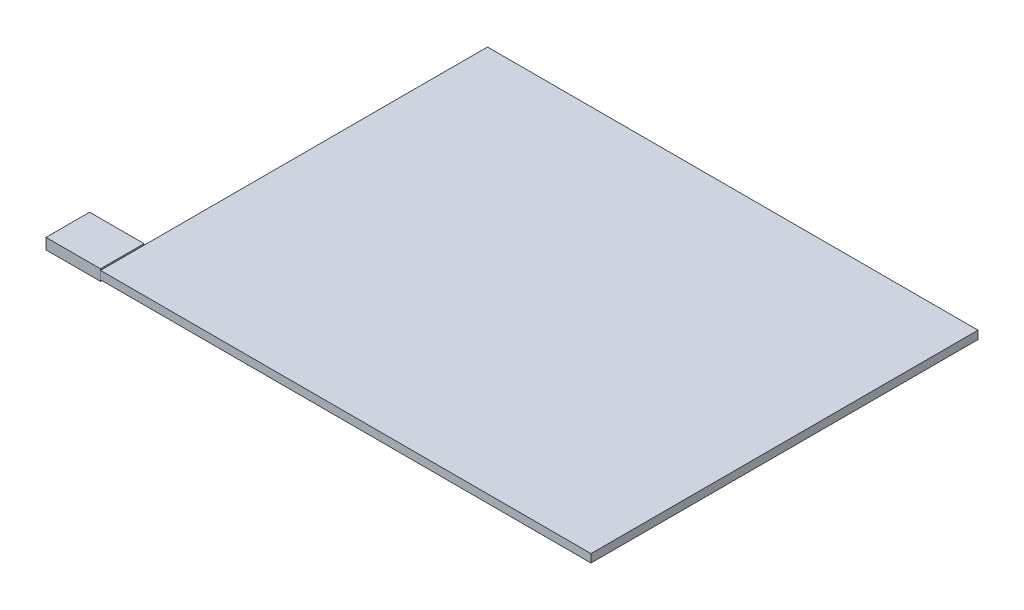
ISO-10303-21;
HEADER;
FILE_DESCRIPTION(('STEP AP214'),'2;1');
FILE_NAME('part.step','',(''),(''),'','','');
FILE_SCHEMA(('AUTOMOTIVE_DESIGN { 1 0 10303 214 1 1 1 1 }'));
ENDSEC;
DATA;
#1=APPLICATION_CONTEXT('core data for automotive mechanical design processes');
#2=APPLICATION_PROTOCOL_DEFINITION('international standard','automotive_design',2000,#1);
#3=PRODUCT_CONTEXT('',#1,'mechanical');
#4=PRODUCT('Part','Part','',(#3));
#5=PRODUCT_RELATED_PRODUCT_CATEGORY('part','',(#4));
#6=PRODUCT_DEFINITION_FORMATION('','',#4);
#7=PRODUCT_DEFINITION_CONTEXT('part definition',#1,'design');
#8=PRODUCT_DEFINITION('design','',#6,#7);
#9=PRODUCT_DEFINITION_SHAPE('','',#8);
#10=(LENGTH_UNIT() NAMED_UNIT(*) SI_UNIT(.MILLI.,.METRE.));
#11=(NAMED_UNIT(*) PLANE_ANGLE_UNIT() SI_UNIT($,.RADIAN.));
#12=(NAMED_UNIT(*) SI_UNIT($,.STERADIAN.) SOLID_ANGLE_UNIT());
#13=UNCERTAINTY_MEASURE_WITH_UNIT(LENGTH_MEASURE(1.E-05),#10,'distance_accuracy_value','');
#14=(GEOMETRIC_REPRESENTATION_CONTEXT(3) GLOBAL_UNCERTAINTY_ASSIGNED_CONTEXT((#13)) GLOBAL_UNIT_ASSIGNED_CONTEXT((#10,
#11,#12)) REPRESENTATION_CONTEXT('',''));
#15=CARTESIAN_POINT('',(0.,0.,0.));
#16=DIRECTION('',(0.,0.,1.));
#17=DIRECTION('',(1.,0.,0.));
#18=AXIS2_PLACEMENT_3D('',#15,#16,#17);
#19=CARTESIAN_POINT('',(-74.,1.,52.5));
#20=DIRECTION('',(-1.,0.,0.));
#21=DIRECTION('',(0.,0.,1.));
#22=AXIS2_PLACEMENT_3D('',#19,#20,#21);
#23=PLANE('',#22);
#24=DIRECTION('',(0.,0.,-1.));
#25=VECTOR('',#24,1.);
#26=CARTESIAN_POINT('',(-74.,-1.,52.5));
#27=LINE('',#26,#25);
#28=CARTESIAN_POINT('',(-74.,-1.,52.5));
#29=VERTEX_POINT('',#28);
#30=CARTESIAN_POINT('',(-74.,-1.,44.5));
#31=VERTEX_POINT('',#30);
#32=EDGE_CURVE('E111',#29,#31,#27,.T.);
#33=ORIENTED_EDGE('',*,*,#32,.T.);
#34=DIRECTION('',(0.,-1.,0.));
#35=VECTOR('',#34,1.);
#36=CARTESIAN_POINT('',(-74.,1.,44.5));
#37=LINE('',#36,#35);
#38=CARTESIAN_POINT('',(-74.,1.,44.5));
#39=VERTEX_POINT('',#38);
#40=EDGE_CURVE('E12',#39,#31,#37,.T.);
#41=ORIENTED_EDGE('',*,*,#40,.F.);
#42=DIRECTION('',(0.,0.,-1.));
#43=VECTOR('',#42,1.);
#44=CARTESIAN_POINT('',(-74.,1.,52.5));
#45=LINE('',#44,#43);
#46=CARTESIAN_POINT('',(-74.,1.,52.5));
#47=VERTEX_POINT('',#46);
#48=EDGE_CURVE('E99',#47,#39,#45,.T.);
#49=ORIENTED_EDGE('',*,*,#48,.F.);
#50=DIRECTION('',(0.,-1.,0.));
#51=VECTOR('',#50,1.);
#52=CARTESIAN_POINT('',(-74.,1.,52.5));
#53=LINE('',#52,#51);
#54=EDGE_CURVE('E107',#47,#29,#53,.T.);
#55=ORIENTED_EDGE('',*,*,#54,.T.);
#56=EDGE_LOOP('',(#33,#41,#49,#55));
#57=FACE_BOUND('',#56,.T.);
#58=ADVANCED_FACE('F48',(#57),#23,.F.);
#59=CARTESIAN_POINT('',(-74.,1.,44.5));
#60=DIRECTION('',(0.,0.,1.));
#61=DIRECTION('',(1.,0.,0.));
#62=AXIS2_PLACEMENT_3D('',#59,#60,#61);
#63=PLANE('',#62);
#64=DIRECTION('',(-1.,0.,0.));
#65=VECTOR('',#64,1.);
#66=CARTESIAN_POINT('',(-74.,-1.,44.5));
#67=LINE('',#66,#65);
#68=CARTESIAN_POINT('',(-84.,-1.,44.5));
#69=VERTEX_POINT('',#68);
#70=EDGE_CURVE('E103',#31,#69,#67,.T.);
#71=ORIENTED_EDGE('',*,*,#70,.T.);
#72=DIRECTION('',(0.,-1.,0.));
#73=VECTOR('',#72,1.);
#74=CARTESIAN_POINT('',(-84.,1.,44.5));
#75=LINE('',#74,#73);
#76=CARTESIAN_POINT('',(-84.,1.,44.5));
#77=VERTEX_POINT('',#76);
#78=EDGE_CURVE('E56',#77,#69,#75,.T.);
#79=ORIENTED_EDGE('',*,*,#78,.F.);
#80=DIRECTION('',(-1.,0.,0.));
#81=VECTOR('',#80,1.);
#82=CARTESIAN_POINT('',(-74.,1.,44.5));
#83=LINE('',#82,#81);
#84=EDGE_CURVE('E94',#39,#77,#83,.T.);
#85=ORIENTED_EDGE('',*,*,#84,.F.);
#86=ORIENTED_EDGE('',*,*,#40,.T.);
#87=EDGE_LOOP('',(#71,#79,#85,#86));
#88=FACE_BOUND('',#87,.T.);
#89=ADVANCED_FACE('F102',(#88),#63,.F.);
#90=CARTESIAN_POINT('',(-84.,1.,52.5));
#91=DIRECTION('',(1.,0.,0.));
#92=DIRECTION('',(0.,0.,-1.));
#93=AXIS2_PLACEMENT_3D('',#90,#91,#92);
#94=PLANE('',#93);
#95=DIRECTION('',(0.,0.,1.));
#96=VECTOR('',#95,1.);
#97=CARTESIAN_POINT('',(-84.,-1.,52.5));
#98=LINE('',#97,#96);
#99=CARTESIAN_POINT('',(-84.,-1.,52.5));
#100=VERTEX_POINT('',#99);
#101=EDGE_CURVE('E81',#69,#100,#98,.T.);
#102=ORIENTED_EDGE('',*,*,#101,.T.);
#103=DIRECTION('',(0.,-1.,0.));
#104=VECTOR('',#103,1.);
#105=CARTESIAN_POINT('',(-84.,1.,52.5));
#106=LINE('',#105,#104);
#107=CARTESIAN_POINT('',(-84.,1.,52.5));
#108=VERTEX_POINT('',#107);
#109=EDGE_CURVE('E104',#108,#100,#106,.T.);
#110=ORIENTED_EDGE('',*,*,#109,.F.);
#111=DIRECTION('',(0.,0.,1.));
#112=VECTOR('',#111,1.);
#113=CARTESIAN_POINT('',(-84.,1.,52.5));
#114=LINE('',#113,#112);
#115=EDGE_CURVE('E97',#77,#108,#114,.T.);
#116=ORIENTED_EDGE('',*,*,#115,.F.);
#117=ORIENTED_EDGE('',*,*,#78,.T.);
#118=EDGE_LOOP('',(#102,#110,#116,#117));
#119=FACE_BOUND('',#118,.T.);
#120=ADVANCED_FACE('F105',(#119),#94,.F.);
#121=CARTESIAN_POINT('',(-74.,1.,52.5));
#122=DIRECTION('',(0.,0.,-1.));
#123=DIRECTION('',(-1.,0.,0.));
#124=AXIS2_PLACEMENT_3D('',#121,#122,#123);
#125=PLANE('',#124);
#126=DIRECTION('',(1.,0.,0.));
#127=VECTOR('',#126,1.);
#128=CARTESIAN_POINT('',(-74.,-1.,52.5));
#129=LINE('',#128,#127);
#130=EDGE_CURVE('E87',#100,#29,#129,.T.);
#131=ORIENTED_EDGE('',*,*,#130,.T.);
#132=ORIENTED_EDGE('',*,*,#54,.F.);
#133=DIRECTION('',(1.,0.,0.));
#134=VECTOR('',#133,1.);
#135=CARTESIAN_POINT('',(-74.,1.,52.5));
#136=LINE('',#135,#134);
#137=EDGE_CURVE('E64',#108,#47,#136,.T.);
#138=ORIENTED_EDGE('',*,*,#137,.F.);
#139=ORIENTED_EDGE('',*,*,#109,.T.);
#140=EDGE_LOOP('',(#131,#132,#138,#139));
#141=FACE_BOUND('',#140,.T.);
#142=ADVANCED_FACE('F118',(#141),#125,.F.);
#143=CARTESIAN_POINT('',(0.,1.,0.));
#144=DIRECTION('',(0.,1.,0.));
#145=DIRECTION('',(0.,0.,1.));
#146=AXIS2_PLACEMENT_3D('',#143,#144,#145);
#147=PLANE('',#146);
#148=ORIENTED_EDGE('',*,*,#48,.T.);
#149=ORIENTED_EDGE('',*,*,#84,.T.);
#150=ORIENTED_EDGE('',*,*,#115,.T.);
#151=ORIENTED_EDGE('',*,*,#137,.T.);
#152=EDGE_LOOP('',(#148,#149,#150,#151));
#153=FACE_BOUND('',#152,.T.);
#154=ADVANCED_FACE('F95',(#153),#147,.T.);
#155=CARTESIAN_POINT('',(0.,-1.,0.));
#156=DIRECTION('',(0.,1.,0.));
#157=DIRECTION('',(0.,0.,1.));
#158=AXIS2_PLACEMENT_3D('',#155,#156,#157);
#159=PLANE('',#158);
#160=ORIENTED_EDGE('',*,*,#32,.F.);
#161=ORIENTED_EDGE('',*,*,#130,.F.);
#162=ORIENTED_EDGE('',*,*,#101,.F.);
#163=ORIENTED_EDGE('',*,*,#70,.F.);
#164=EDGE_LOOP('',(#160,#161,#162,#163));
#165=FACE_BOUND('',#164,.T.);
#166=ADVANCED_FACE('F121',(#165),#159,.F.);
#167=CLOSED_SHELL('',(#58,#89,#120,#142,#154,#166));
#168=MANIFOLD_SOLID_BREP('B2',#167);
#169=CARTESIAN_POINT('',(0.,0.75,52.5));
#170=DIRECTION('',(0.,0.,-1.));
#171=DIRECTION('',(-1.,0.,0.));
#172=AXIS2_PLACEMENT_3D('',#169,#170,#171);
#173=PLANE('',#172);
#174=DIRECTION('',(0.,1.,0.));
#175=VECTOR('',#174,1.);
#176=CARTESIAN_POINT('',(16.,-1.001,52.5));
#177=LINE('',#176,#175);
#178=CARTESIAN_POINT('',(16.,-0.75,52.5));
#179=VERTEX_POINT('',#178);
#180=CARTESIAN_POINT('',(16.,0.75,52.5));
#181=VERTEX_POINT('',#180);
#182=EDGE_CURVE('E212',#179,#181,#177,.T.);
#183=ORIENTED_EDGE('',*,*,#182,.T.);
#184=DIRECTION('',(1.,0.,0.));
#185=VECTOR('',#184,1.);
#186=CARTESIAN_POINT('',(0.,0.75,52.5));
#187=LINE('',#186,#185);
#188=CARTESIAN_POINT('',(-74.,0.75,52.5));
#189=VERTEX_POINT('',#188);
#190=EDGE_CURVE('E179',#189,#181,#187,.T.);
#191=ORIENTED_EDGE('',*,*,#190,.F.);
#192=DIRECTION('',(0.,-1.,0.));
#193=VECTOR('',#192,1.);
#194=CARTESIAN_POINT('',(-74.,0.75,52.5));
#195=LINE('',#194,#193);
#196=CARTESIAN_POINT('',(-74.,-0.75,52.5));
#197=VERTEX_POINT('',#196);
#198=EDGE_CURVE('E46',#189,#197,#195,.T.);
#199=ORIENTED_EDGE('',*,*,#198,.T.);
#200=DIRECTION('',(1.,0.,0.));
#201=VECTOR('',#200,1.);
#202=CARTESIAN_POINT('',(0.,-0.75,52.5));
#203=LINE('',#202,#201);
#204=EDGE_CURVE('E227',#197,#179,#203,.T.);
#205=ORIENTED_EDGE('',*,*,#204,.T.);
#206=EDGE_LOOP('',(#183,#191,#199,#205));
#207=FACE_BOUND('',#206,.T.);
#208=ADVANCED_FACE('F171',(#207),#173,.F.);
#209=CARTESIAN_POINT('',(0.,0.75,0.));
#210=DIRECTION('',(0.,1.,0.));
#211=DIRECTION('',(0.,0.,1.));
#212=AXIS2_PLACEMENT_3D('',#209,#210,#211);
#213=PLANE('',#212);
#214=ORIENTED_EDGE('',*,*,#190,.T.);
#215=DIRECTION('',(0.,0.,-1.));
#216=VECTOR('',#215,1.);
#217=CARTESIAN_POINT('',(16.,0.75,0.));
#218=LINE('',#217,#216);
#219=CARTESIAN_POINT('',(16.,0.75,-18.5));
#220=VERTEX_POINT('',#219);
#221=EDGE_CURVE('E215',#181,#220,#218,.T.);
#222=ORIENTED_EDGE('',*,*,#221,.T.);
#223=DIRECTION('',(1.,0.,0.));
#224=VECTOR('',#223,1.);
#225=CARTESIAN_POINT('',(0.,0.75,-18.5));
#226=LINE('',#225,#224);
#227=CARTESIAN_POINT('',(-74.,0.75,-18.5));
#228=VERTEX_POINT('',#227);
#229=EDGE_CURVE('E220',#228,#220,#226,.T.);
#230=ORIENTED_EDGE('',*,*,#229,.F.);
#231=DIRECTION('',(0.,0.,1.));
#232=VECTOR('',#231,1.);
#233=CARTESIAN_POINT('',(-74.,0.75,0.));
#234=LINE('',#233,#232);
#235=EDGE_CURVE('E195',#228,#189,#234,.T.);
#236=ORIENTED_EDGE('',*,*,#235,.T.);
#237=EDGE_LOOP('',(#214,#222,#230,#236));
#238=FACE_BOUND('',#237,.T.);
#239=ADVANCED_FACE('F245',(#238),#213,.T.);
#240=CARTESIAN_POINT('',(0.,-0.75,0.));
#241=DIRECTION('',(0.,1.,0.));
#242=DIRECTION('',(0.,0.,1.));
#243=AXIS2_PLACEMENT_3D('',#240,#241,#242);
#244=PLANE('',#243);
#245=DIRECTION('',(0.,0.,1.));
#246=VECTOR('',#245,1.);
#247=CARTESIAN_POINT('',(16.,-0.75,0.));
#248=LINE('',#247,#246);
#249=CARTESIAN_POINT('',(16.,-0.75,-18.5));
#250=VERTEX_POINT('',#249);
#251=EDGE_CURVE('E186',#250,#179,#248,.T.);
#252=ORIENTED_EDGE('',*,*,#251,.T.);
#253=ORIENTED_EDGE('',*,*,#204,.F.);
#254=DIRECTION('',(0.,0.,1.));
#255=VECTOR('',#254,1.);
#256=CARTESIAN_POINT('',(-74.,-0.75,0.));
#257=LINE('',#256,#255);
#258=CARTESIAN_POINT('',(-74.,-0.75,-18.5));
#259=VERTEX_POINT('',#258);
#260=EDGE_CURVE('E230',#259,#197,#257,.T.);
#261=ORIENTED_EDGE('',*,*,#260,.F.);
#262=DIRECTION('',(-1.,0.,0.));
#263=VECTOR('',#262,1.);
#264=CARTESIAN_POINT('',(0.,-0.75,-18.5));
#265=LINE('',#264,#263);
#266=EDGE_CURVE('E228',#250,#259,#265,.T.);
#267=ORIENTED_EDGE('',*,*,#266,.F.);
#268=EDGE_LOOP('',(#252,#253,#261,#267));
#269=FACE_BOUND('',#268,.T.);
#270=ADVANCED_FACE('F225',(#269),#244,.F.);
#271=CARTESIAN_POINT('',(-74.,0.75,0.));
#272=DIRECTION('',(1.,0.,0.));
#273=DIRECTION('',(0.,0.,-1.));
#274=AXIS2_PLACEMENT_3D('',#271,#272,#273);
#275=PLANE('',#274);
#276=ORIENTED_EDGE('',*,*,#235,.F.);
#277=DIRECTION('',(0.,1.,0.));
#278=VECTOR('',#277,1.);
#279=CARTESIAN_POINT('',(-74.,-1.001,-18.5));
#280=LINE('',#279,#278);
#281=EDGE_CURVE('E219',#259,#228,#280,.T.);
#282=ORIENTED_EDGE('',*,*,#281,.F.);
#283=ORIENTED_EDGE('',*,*,#260,.T.);
#284=ORIENTED_EDGE('',*,*,#198,.F.);
#285=EDGE_LOOP('',(#276,#282,#283,#284));
#286=FACE_BOUND('',#285,.T.);
#287=ADVANCED_FACE('F173',(#286),#275,.F.);
#288=CARTESIAN_POINT('',(16.,-1.001,0.));
#289=DIRECTION('',(1.,0.,0.));
#290=DIRECTION('',(0.,0.,-1.));
#291=AXIS2_PLACEMENT_3D('',#288,#289,#290);
#292=PLANE('',#291);
#293=DIRECTION('',(0.,1.,0.));
#294=VECTOR('',#293,1.);
#295=CARTESIAN_POINT('',(16.,-1.001,-18.5));
#296=LINE('',#295,#294);
#297=EDGE_CURVE('E232',#250,#220,#296,.T.);
#298=ORIENTED_EDGE('',*,*,#297,.T.);
#299=ORIENTED_EDGE('',*,*,#221,.F.);
#300=ORIENTED_EDGE('',*,*,#182,.F.);
#301=ORIENTED_EDGE('',*,*,#251,.F.);
#302=EDGE_LOOP('',(#298,#299,#300,#301));
#303=FACE_BOUND('',#302,.T.);
#304=ADVANCED_FACE('F213',(#303),#292,.T.);
#305=CARTESIAN_POINT('',(0.,-1.001,-18.5));
#306=DIRECTION('',(0.,0.,1.));
#307=DIRECTION('',(1.,0.,0.));
#308=AXIS2_PLACEMENT_3D('',#305,#306,#307);
#309=PLANE('',#308);
#310=ORIENTED_EDGE('',*,*,#266,.T.);
#311=ORIENTED_EDGE('',*,*,#281,.T.);
#312=ORIENTED_EDGE('',*,*,#229,.T.);
#313=ORIENTED_EDGE('',*,*,#297,.F.);
#314=EDGE_LOOP('',(#310,#311,#312,#313));
#315=FACE_BOUND('',#314,.T.);
#316=ADVANCED_FACE('F243',(#315),#309,.F.);
#317=CLOSED_SHELL('',(#208,#239,#270,#287,#304,#316));
#318=MANIFOLD_SOLID_BREP('B6',#317);
#319=ADVANCED_BREP_SHAPE_REPRESENTATION('',(#18,#168,#318),#14);
#320=SHAPE_DEFINITION_REPRESENTATION(#9,#319);
ENDSEC;
END-ISO-10303-21;
